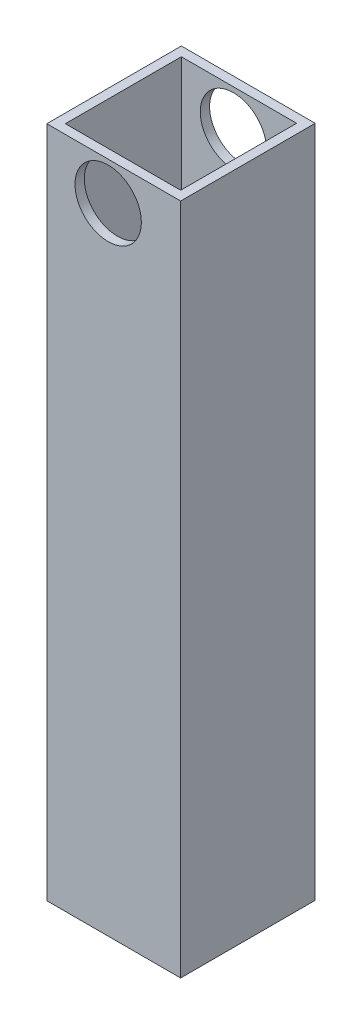
ISO-10303-21;
HEADER;
FILE_DESCRIPTION(('STEP AP214'),'2;1');
FILE_NAME('part.step','',(''),(''),'','','');
FILE_SCHEMA(('AUTOMOTIVE_DESIGN { 1 0 10303 214 1 1 1 1 }'));
ENDSEC;
DATA;
#1=APPLICATION_CONTEXT('core data for automotive mechanical design processes');
#2=APPLICATION_PROTOCOL_DEFINITION('international standard','automotive_design',2000,#1);
#3=PRODUCT_CONTEXT('',#1,'mechanical');
#4=PRODUCT('Part','Part','',(#3));
#5=PRODUCT_RELATED_PRODUCT_CATEGORY('part','',(#4));
#6=PRODUCT_DEFINITION_FORMATION('','',#4);
#7=PRODUCT_DEFINITION_CONTEXT('part definition',#1,'design');
#8=PRODUCT_DEFINITION('design','',#6,#7);
#9=PRODUCT_DEFINITION_SHAPE('','',#8);
#10=(LENGTH_UNIT() NAMED_UNIT(*) SI_UNIT(.MILLI.,.METRE.));
#11=(NAMED_UNIT(*) PLANE_ANGLE_UNIT() SI_UNIT($,.RADIAN.));
#12=(NAMED_UNIT(*) SI_UNIT($,.STERADIAN.) SOLID_ANGLE_UNIT());
#13=UNCERTAINTY_MEASURE_WITH_UNIT(LENGTH_MEASURE(1.E-05),#10,'distance_accuracy_value','');
#14=(GEOMETRIC_REPRESENTATION_CONTEXT(3) GLOBAL_UNCERTAINTY_ASSIGNED_CONTEXT((#13)) GLOBAL_UNIT_ASSIGNED_CONTEXT((#10,
#11,#12)) REPRESENTATION_CONTEXT('',''));
#15=CARTESIAN_POINT('',(0.,0.,0.));
#16=DIRECTION('',(0.,0.,1.));
#17=DIRECTION('',(1.,0.,0.));
#18=AXIS2_PLACEMENT_3D('',#15,#16,#17);
#19=CARTESIAN_POINT('',(0.,127.,0.));
#20=DIRECTION('',(0.,1.,0.));
#21=DIRECTION('',(0.,0.,1.));
#22=AXIS2_PLACEMENT_3D('',#19,#20,#21);
#23=PLANE('',#22);
#24=DIRECTION('',(-1.,0.,0.));
#25=VECTOR('',#24,1.);
#26=CARTESIAN_POINT('',(25.262112461566,127.,-25.4));
#27=LINE('',#26,#25);
#28=CARTESIAN_POINT('',(25.262112461566,127.,-25.4));
#29=VERTEX_POINT('',#28);
#30=CARTESIAN_POINT('',(0.,127.,-25.4));
#31=VERTEX_POINT('',#30);
#32=EDGE_CURVE('E145',#29,#31,#27,.T.);
#33=ORIENTED_EDGE('',*,*,#32,.T.);
#34=DIRECTION('',(0.,0.,1.));
#35=VECTOR('',#34,1.);
#36=CARTESIAN_POINT('',(0.,127.,-25.4));
#37=LINE('',#36,#35);
#38=CARTESIAN_POINT('',(0.,127.,0.));
#39=VERTEX_POINT('',#38);
#40=EDGE_CURVE('E148',#31,#39,#37,.T.);
#41=ORIENTED_EDGE('',*,*,#40,.T.);
#42=DIRECTION('',(1.,0.,0.));
#43=VECTOR('',#42,1.);
#44=CARTESIAN_POINT('',(0.,127.,0.));
#45=LINE('',#44,#43);
#46=CARTESIAN_POINT('',(25.262112461566,127.,0.));
#47=VERTEX_POINT('',#46);
#48=EDGE_CURVE('E151',#39,#47,#45,.T.);
#49=ORIENTED_EDGE('',*,*,#48,.T.);
#50=DIRECTION('',(0.,0.,-1.));
#51=VECTOR('',#50,1.);
#52=CARTESIAN_POINT('',(25.262112461566,127.,0.));
#53=LINE('',#52,#51);
#54=EDGE_CURVE('E153',#47,#29,#53,.T.);
#55=ORIENTED_EDGE('',*,*,#54,.T.);
#56=EDGE_LOOP('',(#33,#41,#49,#55));
#57=FACE_BOUND('',#56,.T.);
#58=DIRECTION('',(0.,0.,1.));
#59=VECTOR('',#58,1.);
#60=CARTESIAN_POINT('',(23.509512461566,127.,-23.6474));
#61=LINE('',#60,#59);
#62=CARTESIAN_POINT('',(23.509512461566,127.,-23.6474));
#63=VERTEX_POINT('',#62);
#64=CARTESIAN_POINT('',(23.509512461566,127.,-1.7526));
#65=VERTEX_POINT('',#64);
#66=EDGE_CURVE('E111',#63,#65,#61,.T.);
#67=ORIENTED_EDGE('',*,*,#66,.T.);
#68=DIRECTION('',(1.,0.,0.));
#69=VECTOR('',#68,1.);
#70=CARTESIAN_POINT('',(1.7526,127.,-1.7526));
#71=LINE('',#70,#69);
#72=CARTESIAN_POINT('',(1.7526,127.,-1.7526));
#73=VERTEX_POINT('',#72);
#74=EDGE_CURVE('E101',#73,#65,#71,.T.);
#75=ORIENTED_EDGE('',*,*,#74,.F.);
#76=DIRECTION('',(0.,0.,1.));
#77=VECTOR('',#76,1.);
#78=CARTESIAN_POINT('',(1.7526,127.,-23.6474));
#79=LINE('',#78,#77);
#80=CARTESIAN_POINT('',(1.7526,127.,-23.6474));
#81=VERTEX_POINT('',#80);
#82=EDGE_CURVE('E123',#81,#73,#79,.T.);
#83=ORIENTED_EDGE('',*,*,#82,.F.);
#84=DIRECTION('',(1.,0.,0.));
#85=VECTOR('',#84,1.);
#86=CARTESIAN_POINT('',(1.7526,127.,-23.6474));
#87=LINE('',#86,#85);
#88=EDGE_CURVE('E52',#81,#63,#87,.T.);
#89=ORIENTED_EDGE('',*,*,#88,.T.);
#90=EDGE_LOOP('',(#67,#75,#83,#89));
#91=FACE_BOUND('',#90,.T.);
#92=ADVANCED_FACE('F35',(#57,#91),#23,.T.);
#93=CARTESIAN_POINT('',(0.,0.,0.));
#94=DIRECTION('',(0.,1.,0.));
#95=DIRECTION('',(0.,0.,1.));
#96=AXIS2_PLACEMENT_3D('',#93,#94,#95);
#97=PLANE('',#96);
#98=DIRECTION('',(-1.,0.,0.));
#99=VECTOR('',#98,1.);
#100=CARTESIAN_POINT('',(25.262112461566,0.,-25.4));
#101=LINE('',#100,#99);
#102=CARTESIAN_POINT('',(25.262112461566,0.,-25.4));
#103=VERTEX_POINT('',#102);
#104=CARTESIAN_POINT('',(0.,0.,-25.4));
#105=VERTEX_POINT('',#104);
#106=EDGE_CURVE('E141',#103,#105,#101,.T.);
#107=ORIENTED_EDGE('',*,*,#106,.F.);
#108=DIRECTION('',(0.,0.,-1.));
#109=VECTOR('',#108,1.);
#110=CARTESIAN_POINT('',(25.262112461566,0.,0.));
#111=LINE('',#110,#109);
#112=CARTESIAN_POINT('',(25.262112461566,0.,0.));
#113=VERTEX_POINT('',#112);
#114=EDGE_CURVE('E149',#113,#103,#111,.T.);
#115=ORIENTED_EDGE('',*,*,#114,.F.);
#116=DIRECTION('',(1.,0.,0.));
#117=VECTOR('',#116,1.);
#118=CARTESIAN_POINT('',(0.,0.,0.));
#119=LINE('',#118,#117);
#120=CARTESIAN_POINT('',(0.,0.,0.));
#121=VERTEX_POINT('',#120);
#122=EDGE_CURVE('E160',#121,#113,#119,.T.);
#123=ORIENTED_EDGE('',*,*,#122,.F.);
#124=DIRECTION('',(0.,0.,1.));
#125=VECTOR('',#124,1.);
#126=CARTESIAN_POINT('',(0.,0.,-25.4));
#127=LINE('',#126,#125);
#128=EDGE_CURVE('E158',#105,#121,#127,.T.);
#129=ORIENTED_EDGE('',*,*,#128,.F.);
#130=EDGE_LOOP('',(#107,#115,#123,#129));
#131=FACE_BOUND('',#130,.T.);
#132=DIRECTION('',(1.,0.,0.));
#133=VECTOR('',#132,1.);
#134=CARTESIAN_POINT('',(1.7526,0.,-1.7526));
#135=LINE('',#134,#133);
#136=CARTESIAN_POINT('',(1.7526,0.,-1.7526));
#137=VERTEX_POINT('',#136);
#138=CARTESIAN_POINT('',(23.509512461566,0.,-1.7526));
#139=VERTEX_POINT('',#138);
#140=EDGE_CURVE('E60',#137,#139,#135,.T.);
#141=ORIENTED_EDGE('',*,*,#140,.T.);
#142=DIRECTION('',(0.,0.,1.));
#143=VECTOR('',#142,1.);
#144=CARTESIAN_POINT('',(23.509512461566,0.,-23.6474));
#145=LINE('',#144,#143);
#146=CARTESIAN_POINT('',(23.509512461566,0.,-23.6474));
#147=VERTEX_POINT('',#146);
#148=EDGE_CURVE('E118',#147,#139,#145,.T.);
#149=ORIENTED_EDGE('',*,*,#148,.F.);
#150=DIRECTION('',(1.,0.,0.));
#151=VECTOR('',#150,1.);
#152=CARTESIAN_POINT('',(1.7526,0.,-23.6474));
#153=LINE('',#152,#151);
#154=CARTESIAN_POINT('',(1.7526,0.,-23.6474));
#155=VERTEX_POINT('',#154);
#156=EDGE_CURVE('E129',#155,#147,#153,.T.);
#157=ORIENTED_EDGE('',*,*,#156,.F.);
#158=DIRECTION('',(0.,0.,1.));
#159=VECTOR('',#158,1.);
#160=CARTESIAN_POINT('',(1.7526,0.,-23.6474));
#161=LINE('',#160,#159);
#162=EDGE_CURVE('E112',#155,#137,#161,.T.);
#163=ORIENTED_EDGE('',*,*,#162,.T.);
#164=EDGE_LOOP('',(#141,#149,#157,#163));
#165=FACE_BOUND('',#164,.T.);
#166=ADVANCED_FACE('F177',(#131,#165),#97,.F.);
#167=CARTESIAN_POINT('',(11.5872221393425,119.780054763503,-25.4));
#168=DIRECTION('',(0.,0.,1.));
#169=DIRECTION('',(1.,0.,0.));
#170=AXIS2_PLACEMENT_3D('',#167,#168,#169);
#171=CYLINDRICAL_SURFACE('',#170,6.26300454864326);
#172=CARTESIAN_POINT('',(11.5872221393425,119.780054763503,0.));
#173=DIRECTION('',(0.,0.,1.));
#174=DIRECTION('',(1.,0.,0.));
#175=AXIS2_PLACEMENT_3D('',#172,#173,#174);
#176=CIRCLE('',#175,6.26300454864326);
#177=CARTESIAN_POINT('',(17.8502266879857,119.780054763503,0.));
#178=VERTEX_POINT('',#177);
#179=EDGE_CURVE('E142',#178,#178,#176,.T.);
#180=ORIENTED_EDGE('',*,*,#179,.T.);
#181=EDGE_LOOP('',(#180));
#182=FACE_BOUND('',#181,.T.);
#183=CARTESIAN_POINT('',(11.5872221393425,119.780054763503,-1.7526));
#184=DIRECTION('',(0.,0.,-1.));
#185=DIRECTION('',(-1.,0.,0.));
#186=AXIS2_PLACEMENT_3D('',#183,#184,#185);
#187=CIRCLE('',#186,6.26300454864326);
#188=CARTESIAN_POINT('',(5.3242175906992,119.780054763503,-1.7526));
#189=VERTEX_POINT('',#188);
#190=EDGE_CURVE('E39',#189,#189,#187,.F.);
#191=ORIENTED_EDGE('',*,*,#190,.F.);
#192=EDGE_LOOP('',(#191));
#193=FACE_BOUND('',#192,.T.);
#194=ADVANCED_FACE('F175',(#182,#193),#171,.F.);
#195=CARTESIAN_POINT('',(25.262112461566,127.,-25.4));
#196=DIRECTION('',(0.,0.,1.));
#197=DIRECTION('',(1.,0.,0.));
#198=AXIS2_PLACEMENT_3D('',#195,#196,#197);
#199=PLANE('',#198);
#200=CARTESIAN_POINT('',(11.5872221393425,119.780054763503,-25.4));
#201=DIRECTION('',(0.,0.,1.));
#202=DIRECTION('',(1.,0.,0.));
#203=AXIS2_PLACEMENT_3D('',#200,#201,#202);
#204=CIRCLE('',#203,6.26300454864326);
#205=CARTESIAN_POINT('',(17.8502266879857,119.780054763503,-25.4));
#206=VERTEX_POINT('',#205);
#207=EDGE_CURVE('E138',#206,#206,#204,.T.);
#208=ORIENTED_EDGE('',*,*,#207,.T.);
#209=EDGE_LOOP('',(#208));
#210=FACE_BOUND('',#209,.T.);
#211=ORIENTED_EDGE('',*,*,#106,.T.);
#212=DIRECTION('',(0.,-1.,0.));
#213=VECTOR('',#212,1.);
#214=CARTESIAN_POINT('',(0.,127.,-25.4));
#215=LINE('',#214,#213);
#216=EDGE_CURVE('E11',#31,#105,#215,.T.);
#217=ORIENTED_EDGE('',*,*,#216,.F.);
#218=ORIENTED_EDGE('',*,*,#32,.F.);
#219=DIRECTION('',(0.,-1.,0.));
#220=VECTOR('',#219,1.);
#221=CARTESIAN_POINT('',(25.262112461566,127.,-25.4));
#222=LINE('',#221,#220);
#223=EDGE_CURVE('E155',#29,#103,#222,.T.);
#224=ORIENTED_EDGE('',*,*,#223,.T.);
#225=EDGE_LOOP('',(#211,#217,#218,#224));
#226=FACE_BOUND('',#225,.T.);
#227=ADVANCED_FACE('F37',(#210,#226),#199,.F.);
#228=CARTESIAN_POINT('',(0.,127.,-25.4));
#229=DIRECTION('',(1.,0.,0.));
#230=DIRECTION('',(0.,0.,-1.));
#231=AXIS2_PLACEMENT_3D('',#228,#229,#230);
#232=PLANE('',#231);
#233=ORIENTED_EDGE('',*,*,#128,.T.);
#234=DIRECTION('',(0.,-1.,0.));
#235=VECTOR('',#234,1.);
#236=CARTESIAN_POINT('',(0.,127.,0.));
#237=LINE('',#236,#235);
#238=EDGE_CURVE('E44',#39,#121,#237,.T.);
#239=ORIENTED_EDGE('',*,*,#238,.F.);
#240=ORIENTED_EDGE('',*,*,#40,.F.);
#241=ORIENTED_EDGE('',*,*,#216,.T.);
#242=EDGE_LOOP('',(#233,#239,#240,#241));
#243=FACE_BOUND('',#242,.T.);
#244=ADVANCED_FACE('F185',(#243),#232,.F.);
#245=CARTESIAN_POINT('',(0.,127.,0.));
#246=DIRECTION('',(0.,0.,-1.));
#247=DIRECTION('',(-1.,0.,0.));
#248=AXIS2_PLACEMENT_3D('',#245,#246,#247);
#249=PLANE('',#248);
#250=ORIENTED_EDGE('',*,*,#179,.F.);
#251=EDGE_LOOP('',(#250));
#252=FACE_BOUND('',#251,.T.);
#253=ORIENTED_EDGE('',*,*,#122,.T.);
#254=DIRECTION('',(0.,-1.,0.));
#255=VECTOR('',#254,1.);
#256=CARTESIAN_POINT('',(25.262112461566,127.,0.));
#257=LINE('',#256,#255);
#258=EDGE_CURVE('E165',#47,#113,#257,.T.);
#259=ORIENTED_EDGE('',*,*,#258,.F.);
#260=ORIENTED_EDGE('',*,*,#48,.F.);
#261=ORIENTED_EDGE('',*,*,#238,.T.);
#262=EDGE_LOOP('',(#253,#259,#260,#261));
#263=FACE_BOUND('',#262,.T.);
#264=ADVANCED_FACE('F200',(#252,#263),#249,.F.);
#265=CARTESIAN_POINT('',(25.262112461566,127.,0.));
#266=DIRECTION('',(-1.,0.,0.));
#267=DIRECTION('',(0.,0.,1.));
#268=AXIS2_PLACEMENT_3D('',#265,#266,#267);
#269=PLANE('',#268);
#270=ORIENTED_EDGE('',*,*,#114,.T.);
#271=ORIENTED_EDGE('',*,*,#223,.F.);
#272=ORIENTED_EDGE('',*,*,#54,.F.);
#273=ORIENTED_EDGE('',*,*,#258,.T.);
#274=EDGE_LOOP('',(#270,#271,#272,#273));
#275=FACE_BOUND('',#274,.T.);
#276=ADVANCED_FACE('F192',(#275),#269,.F.);
#277=CARTESIAN_POINT('',(11.5872221393425,119.780054763503,-23.6474));
#278=DIRECTION('',(0.,0.,-1.));
#279=DIRECTION('',(-1.,0.,0.));
#280=AXIS2_PLACEMENT_3D('',#277,#278,#279);
#281=CIRCLE('',#280,6.26300454864326);
#282=CARTESIAN_POINT('',(5.3242175906992,119.780054763503,-23.6474));
#283=VERTEX_POINT('',#282);
#284=EDGE_CURVE('E119',#283,#283,#281,.F.);
#285=ORIENTED_EDGE('',*,*,#284,.T.);
#286=EDGE_LOOP('',(#285));
#287=FACE_BOUND('',#286,.T.);
#288=ORIENTED_EDGE('',*,*,#207,.F.);
#289=EDGE_LOOP('',(#288));
#290=FACE_BOUND('',#289,.T.);
#291=ADVANCED_FACE('F180',(#287,#290),#171,.F.);
#292=CARTESIAN_POINT('',(1.7526,127.,-1.7526));
#293=DIRECTION('',(0.,0.,-1.));
#294=DIRECTION('',(-1.,0.,0.));
#295=AXIS2_PLACEMENT_3D('',#292,#293,#294);
#296=PLANE('',#295);
#297=ORIENTED_EDGE('',*,*,#140,.F.);
#298=DIRECTION('',(0.,-1.,0.));
#299=VECTOR('',#298,1.);
#300=CARTESIAN_POINT('',(1.7526,127.,-1.7526));
#301=LINE('',#300,#299);
#302=EDGE_CURVE('E107',#73,#137,#301,.T.);
#303=ORIENTED_EDGE('',*,*,#302,.F.);
#304=ORIENTED_EDGE('',*,*,#74,.T.);
#305=DIRECTION('',(0.,-1.,0.));
#306=VECTOR('',#305,1.);
#307=CARTESIAN_POINT('',(23.509512461566,127.,-1.7526));
#308=LINE('',#307,#306);
#309=EDGE_CURVE('E105',#65,#139,#308,.T.);
#310=ORIENTED_EDGE('',*,*,#309,.T.);
#311=EDGE_LOOP('',(#297,#303,#304,#310));
#312=FACE_BOUND('',#311,.T.);
#313=ORIENTED_EDGE('',*,*,#190,.T.);
#314=EDGE_LOOP('',(#313));
#315=FACE_BOUND('',#314,.T.);
#316=ADVANCED_FACE('F103',(#312,#315),#296,.T.);
#317=CARTESIAN_POINT('',(1.7526,127.,-23.6474));
#318=DIRECTION('',(0.,0.,-1.));
#319=DIRECTION('',(-1.,0.,0.));
#320=AXIS2_PLACEMENT_3D('',#317,#318,#319);
#321=PLANE('',#320);
#322=ORIENTED_EDGE('',*,*,#156,.T.);
#323=DIRECTION('',(0.,-1.,0.));
#324=VECTOR('',#323,1.);
#325=CARTESIAN_POINT('',(23.509512461566,127.,-23.6474));
#326=LINE('',#325,#324);
#327=EDGE_CURVE('E120',#63,#147,#326,.T.);
#328=ORIENTED_EDGE('',*,*,#327,.F.);
#329=ORIENTED_EDGE('',*,*,#88,.F.);
#330=DIRECTION('',(0.,-1.,0.));
#331=VECTOR('',#330,1.);
#332=CARTESIAN_POINT('',(1.7526,127.,-23.6474));
#333=LINE('',#332,#331);
#334=EDGE_CURVE('E135',#81,#155,#333,.T.);
#335=ORIENTED_EDGE('',*,*,#334,.T.);
#336=EDGE_LOOP('',(#322,#328,#329,#335));
#337=FACE_BOUND('',#336,.T.);
#338=ORIENTED_EDGE('',*,*,#284,.F.);
#339=EDGE_LOOP('',(#338));
#340=FACE_BOUND('',#339,.T.);
#341=ADVANCED_FACE('F225',(#337,#340),#321,.F.);
#342=CARTESIAN_POINT('',(23.509512461566,127.,-23.6474));
#343=DIRECTION('',(1.,0.,0.));
#344=DIRECTION('',(0.,0.,-1.));
#345=AXIS2_PLACEMENT_3D('',#342,#343,#344);
#346=PLANE('',#345);
#347=ORIENTED_EDGE('',*,*,#148,.T.);
#348=ORIENTED_EDGE('',*,*,#309,.F.);
#349=ORIENTED_EDGE('',*,*,#66,.F.);
#350=ORIENTED_EDGE('',*,*,#327,.T.);
#351=EDGE_LOOP('',(#347,#348,#349,#350));
#352=FACE_BOUND('',#351,.T.);
#353=ADVANCED_FACE('F116',(#352),#346,.F.);
#354=CARTESIAN_POINT('',(1.7526,127.,-23.6474));
#355=DIRECTION('',(1.,0.,0.));
#356=DIRECTION('',(0.,0.,-1.));
#357=AXIS2_PLACEMENT_3D('',#354,#355,#356);
#358=PLANE('',#357);
#359=ORIENTED_EDGE('',*,*,#162,.F.);
#360=ORIENTED_EDGE('',*,*,#334,.F.);
#361=ORIENTED_EDGE('',*,*,#82,.T.);
#362=ORIENTED_EDGE('',*,*,#302,.T.);
#363=EDGE_LOOP('',(#359,#360,#361,#362));
#364=FACE_BOUND('',#363,.T.);
#365=ADVANCED_FACE('F224',(#364),#358,.T.);
#366=CLOSED_SHELL('',(#92,#166,#194,#227,#244,#264,#276,#291,#316,#341,#353,#365));
#367=MANIFOLD_SOLID_BREP('B2',#366);
#368=ADVANCED_BREP_SHAPE_REPRESENTATION('',(#18,#367),#14);
#369=SHAPE_DEFINITION_REPRESENTATION(#9,#368);
ENDSEC;
END-ISO-10303-21;
